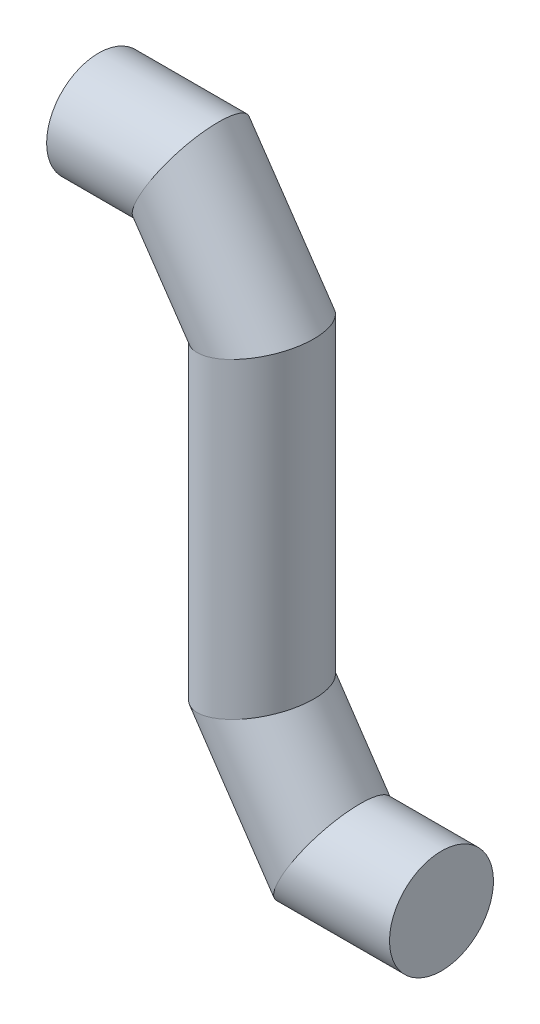
ISO-10303-21;
HEADER;
FILE_DESCRIPTION(('STEP AP214'),'2;1');
FILE_NAME('part.step','',(''),(''),'','','');
FILE_SCHEMA(('AUTOMOTIVE_DESIGN { 1 0 10303 214 1 1 1 1 }'));
ENDSEC;
DATA;
#1=APPLICATION_CONTEXT('core data for automotive mechanical design processes');
#2=APPLICATION_PROTOCOL_DEFINITION('international standard','automotive_design',2000,#1);
#3=PRODUCT_CONTEXT('',#1,'mechanical');
#4=PRODUCT('Part','Part','',(#3));
#5=PRODUCT_RELATED_PRODUCT_CATEGORY('part','',(#4));
#6=PRODUCT_DEFINITION_FORMATION('','',#4);
#7=PRODUCT_DEFINITION_CONTEXT('part definition',#1,'design');
#8=PRODUCT_DEFINITION('design','',#6,#7);
#9=PRODUCT_DEFINITION_SHAPE('','',#8);
#10=(LENGTH_UNIT() NAMED_UNIT(*) SI_UNIT(.MILLI.,.METRE.));
#11=(NAMED_UNIT(*) PLANE_ANGLE_UNIT() SI_UNIT($,.RADIAN.));
#12=(NAMED_UNIT(*) SI_UNIT($,.STERADIAN.) SOLID_ANGLE_UNIT());
#13=UNCERTAINTY_MEASURE_WITH_UNIT(LENGTH_MEASURE(1.E-05),#10,'distance_accuracy_value','');
#14=(GEOMETRIC_REPRESENTATION_CONTEXT(3) GLOBAL_UNCERTAINTY_ASSIGNED_CONTEXT((#13)) GLOBAL_UNIT_ASSIGNED_CONTEXT((#10,
#11,#12)) REPRESENTATION_CONTEXT('',''));
#15=CARTESIAN_POINT('',(0.,0.,0.));
#16=DIRECTION('',(0.,0.,1.));
#17=DIRECTION('',(1.,0.,0.));
#18=AXIS2_PLACEMENT_3D('',#15,#16,#17);
#19=CARTESIAN_POINT('',(17.2718446601942,-25.,0.));
#20=DIRECTION('',(-1.,0.,0.));
#21=DIRECTION('',(0.,0.,1.));
#22=AXIS2_PLACEMENT_3D('',#19,#20,#21);
#23=PLANE('',#22);
#24=CARTESIAN_POINT('',(17.2718446601942,-25.,0.));
#25=DIRECTION('',(-1.,0.,0.));
#26=DIRECTION('',(0.,0.,1.));
#27=AXIS2_PLACEMENT_3D('',#24,#25,#26);
#28=CIRCLE('',#27,5.);
#29=CARTESIAN_POINT('',(17.2718446601942,-25.,5.));
#30=VERTEX_POINT('',#29);
#31=EDGE_CURVE('E46',#30,#30,#28,.T.);
#32=ORIENTED_EDGE('',*,*,#31,.F.);
#33=EDGE_LOOP('',(#32));
#34=FACE_BOUND('',#33,.T.);
#35=ADVANCED_FACE('F43',(#34),#23,.F.);
#36=CARTESIAN_POINT('',(-15.7281553398058,25.,0.));
#37=DIRECTION('',(-1.,0.,0.));
#38=DIRECTION('',(0.,0.,1.));
#39=AXIS2_PLACEMENT_3D('',#36,#37,#38);
#40=PLANE('',#39);
#41=CARTESIAN_POINT('',(-15.7281553398058,25.,0.));
#42=DIRECTION('',(-1.,0.,0.));
#43=DIRECTION('',(0.,0.,1.));
#44=AXIS2_PLACEMENT_3D('',#41,#42,#43);
#45=CIRCLE('',#44,5.);
#46=CARTESIAN_POINT('',(-15.7281553398058,25.,5.));
#47=VERTEX_POINT('',#46);
#48=EDGE_CURVE('E51',#47,#47,#45,.T.);
#49=ORIENTED_EDGE('',*,*,#48,.T.);
#50=EDGE_LOOP('',(#49));
#51=FACE_BOUND('',#50,.T.);
#52=ADVANCED_FACE('F78',(#51),#40,.T.);
#53=CARTESIAN_POINT('',(0.835993850059894,-25.,0.));
#54=DIRECTION('',(1.,0.,0.));
#55=DIRECTION('',(0.,0.,-1.));
#56=AXIS2_PLACEMENT_3D('',#53,#54,#55);
#57=CYLINDRICAL_SURFACE('',#56,5.);
#58=CARTESIAN_POINT('',(6.77184466019418,-25.,0.));
#59=DIRECTION('',(0.883378408389124,-0.4686604182048,0.));
#60=DIRECTION('',(-0.4686604182048,-0.883378408389124,0.));
#61=AXIS2_PLACEMENT_3D('',#58,#59,#60);
#62=ELLIPSE('',#61,5.66008853342669,5.);
#63=CARTESIAN_POINT('',(4.11918520104223,-30.,0.));
#64=VERTEX_POINT('',#63);
#65=EDGE_CURVE('E66',#64,#64,#62,.T.);
#66=ORIENTED_EDGE('',*,*,#65,.T.);
#67=EDGE_LOOP('',(#66));
#68=FACE_BOUND('',#67,.T.);
#69=ORIENTED_EDGE('',*,*,#31,.T.);
#70=EDGE_LOOP('',(#69));
#71=FACE_BOUND('',#70,.T.);
#72=ADVANCED_FACE('F75',(#68,#71),#57,.T.);
#73=CARTESIAN_POINT('',(-1.9479726076894,-12.1234239628386,0.));
#74=DIRECTION('',(0.560714824816203,-0.828008988617475,0.));
#75=DIRECTION('',(0.828008988617476,0.560714824816203,0.));
#76=AXIS2_PLACEMENT_3D('',#73,#74,#75);
#77=CYLINDRICAL_SURFACE('',#76,5.);
#78=CARTESIAN_POINT('',(0.,-15.,0.));
#79=DIRECTION('',(0.293249903139391,-0.956035822712066,0.));
#80=DIRECTION('',(-0.956035822712066,-0.293249903139391,0.));
#81=AXIS2_PLACEMENT_3D('',#78,#79,#80);
#82=ELLIPSE('',#81,5.22992954993683,5.);
#83=CARTESIAN_POINT('',(-5.00000000000001,-16.5336763339448,0.));
#84=VERTEX_POINT('',#83);
#85=EDGE_CURVE('E63',#84,#84,#82,.T.);
#86=ORIENTED_EDGE('',*,*,#85,.T.);
#87=EDGE_LOOP('',(#86));
#88=FACE_BOUND('',#87,.T.);
#89=ORIENTED_EDGE('',*,*,#65,.F.);
#90=EDGE_LOOP('',(#89));
#91=FACE_BOUND('',#90,.T.);
#92=ADVANCED_FACE('F98',(#88,#91),#77,.T.);
#93=CARTESIAN_POINT('',(0.,18.5040499903946,0.));
#94=DIRECTION('',(0.,-1.,0.));
#95=DIRECTION('',(1.,0.,0.));
#96=AXIS2_PLACEMENT_3D('',#93,#94,#95);
#97=CYLINDRICAL_SURFACE('',#96,5.);
#98=CARTESIAN_POINT('',(0.,15.,0.));
#99=DIRECTION('',(0.295627306253754,-0.955303352761388,0.));
#100=DIRECTION('',(0.955303352761388,0.295627306253754,0.));
#101=AXIS2_PLACEMENT_3D('',#98,#99,#100);
#102=ELLIPSE('',#101,5.23393954972215,5.);
#103=CARTESIAN_POINT('',(4.99999999999999,16.5472954501793,0.));
#104=VERTEX_POINT('',#103);
#105=EDGE_CURVE('E57',#104,#104,#102,.T.);
#106=ORIENTED_EDGE('',*,*,#105,.T.);
#107=EDGE_LOOP('',(#106));
#108=FACE_BOUND('',#107,.T.);
#109=ORIENTED_EDGE('',*,*,#85,.F.);
#110=EDGE_LOOP('',(#109));
#111=FACE_BOUND('',#110,.T.);
#112=ADVANCED_FACE('F91',(#108,#111),#97,.T.);
#113=CARTESIAN_POINT('',(-10.1776115198472,29.8694182488548,0.));
#114=DIRECTION('',(0.564827513664058,-0.825208991594298,0.));
#115=DIRECTION('',(0.825208991594298,0.564827513664058,0.));
#116=AXIS2_PLACEMENT_3D('',#113,#114,#115);
#117=CYLINDRICAL_SURFACE('',#116,5.);
#118=CARTESIAN_POINT('',(-6.84466019417475,25.,0.));
#119=DIRECTION('',(0.884541551783764,-0.46646140587188,0.));
#120=DIRECTION('',(0.46646140587188,0.884541551783764,0.));
#121=AXIS2_PLACEMENT_3D('',#118,#119,#120);
#122=ELLIPSE('',#121,5.65264570094759,5.);
#123=CARTESIAN_POINT('',(-4.2079191336151,30.,0.));
#124=VERTEX_POINT('',#123);
#125=EDGE_CURVE('E11',#124,#124,#122,.T.);
#126=ORIENTED_EDGE('',*,*,#125,.T.);
#127=EDGE_LOOP('',(#126));
#128=FACE_BOUND('',#127,.T.);
#129=ORIENTED_EDGE('',*,*,#105,.F.);
#130=EDGE_LOOP('',(#129));
#131=FACE_BOUND('',#130,.T.);
#132=ADVANCED_FACE('F85',(#128,#131),#117,.T.);
#133=CARTESIAN_POINT('',(-15.7281553398058,25.,0.));
#134=DIRECTION('',(1.,0.,0.));
#135=DIRECTION('',(0.,0.,-1.));
#136=AXIS2_PLACEMENT_3D('',#133,#134,#135);
#137=CYLINDRICAL_SURFACE('',#136,5.);
#138=ORIENTED_EDGE('',*,*,#48,.F.);
#139=EDGE_LOOP('',(#138));
#140=FACE_BOUND('',#139,.T.);
#141=ORIENTED_EDGE('',*,*,#125,.F.);
#142=EDGE_LOOP('',(#141));
#143=FACE_BOUND('',#142,.T.);
#144=ADVANCED_FACE('F83',(#140,#143),#137,.T.);
#145=CLOSED_SHELL('',(#35,#52,#72,#92,#112,#132,#144));
#146=MANIFOLD_SOLID_BREP('B2',#145);
#147=ADVANCED_BREP_SHAPE_REPRESENTATION('',(#18,#146),#14);
#148=SHAPE_DEFINITION_REPRESENTATION(#9,#147);
ENDSEC;
END-ISO-10303-21;
